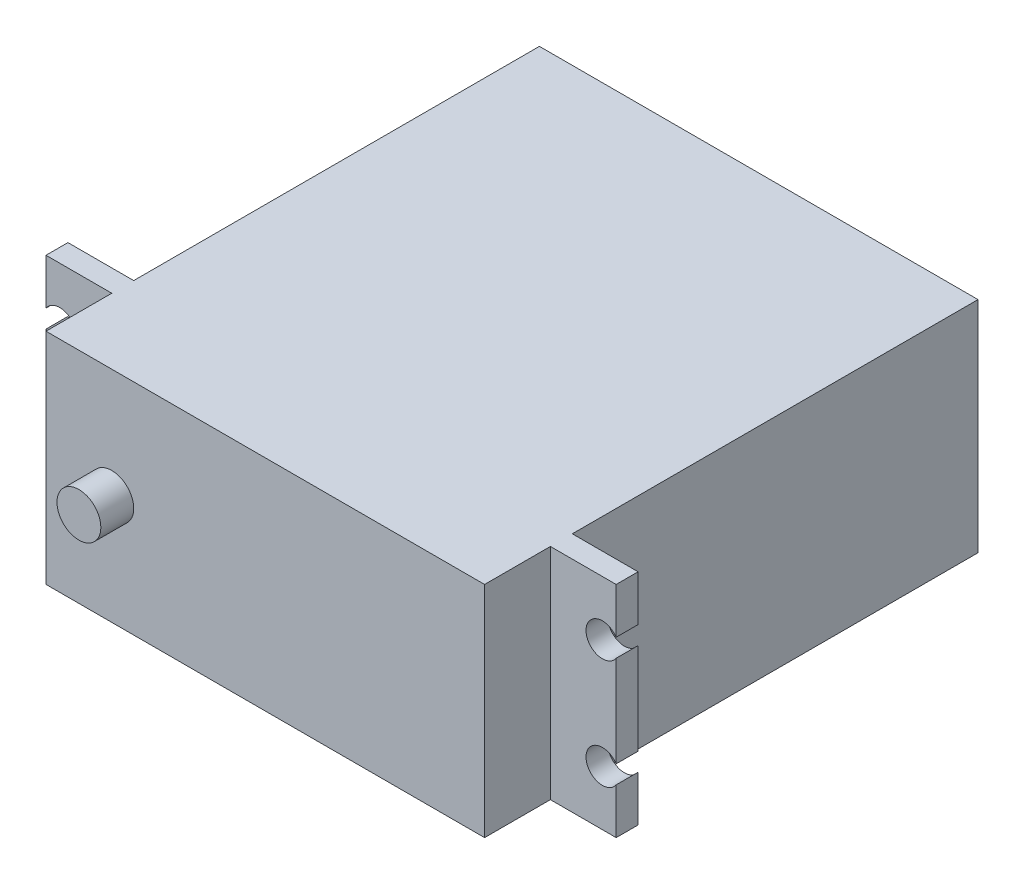
ISO-10303-21;
HEADER;
FILE_DESCRIPTION(('STEP AP214'),'2;1');
FILE_NAME('part.step','',(''),(''),'','','');
FILE_SCHEMA(('AUTOMOTIVE_DESIGN { 1 0 10303 214 1 1 1 1 }'));
ENDSEC;
DATA;
#1=APPLICATION_CONTEXT('core data for automotive mechanical design processes');
#2=APPLICATION_PROTOCOL_DEFINITION('international standard','automotive_design',2000,#1);
#3=PRODUCT_CONTEXT('',#1,'mechanical');
#4=PRODUCT('Part','Part','',(#3));
#5=PRODUCT_RELATED_PRODUCT_CATEGORY('part','',(#4));
#6=PRODUCT_DEFINITION_FORMATION('','',#4);
#7=PRODUCT_DEFINITION_CONTEXT('part definition',#1,'design');
#8=PRODUCT_DEFINITION('design','',#6,#7);
#9=PRODUCT_DEFINITION_SHAPE('','',#8);
#10=(LENGTH_UNIT() NAMED_UNIT(*) SI_UNIT(.MILLI.,.METRE.));
#11=(NAMED_UNIT(*) PLANE_ANGLE_UNIT() SI_UNIT($,.RADIAN.));
#12=(NAMED_UNIT(*) SI_UNIT($,.STERADIAN.) SOLID_ANGLE_UNIT());
#13=UNCERTAINTY_MEASURE_WITH_UNIT(LENGTH_MEASURE(1.E-05),#10,'distance_accuracy_value','');
#14=(GEOMETRIC_REPRESENTATION_CONTEXT(3) GLOBAL_UNCERTAINTY_ASSIGNED_CONTEXT((#13)) GLOBAL_UNIT_ASSIGNED_CONTEXT((#10,
#11,#12)) REPRESENTATION_CONTEXT('',''));
#15=CARTESIAN_POINT('',(0.,0.,0.));
#16=DIRECTION('',(0.,0.,1.));
#17=DIRECTION('',(1.,0.,0.));
#18=AXIS2_PLACEMENT_3D('',#15,#16,#17);
#19=CARTESIAN_POINT('',(-6.,0.,0.));
#20=DIRECTION('',(-1.,0.,0.));
#21=DIRECTION('',(0.,0.,1.));
#22=AXIS2_PLACEMENT_3D('',#19,#20,#21);
#23=PLANE('',#22);
#24=DIRECTION('',(0.,0.,1.));
#25=VECTOR('',#24,1.);
#26=CARTESIAN_POINT('',(-6.,4.17084380241115,33.));
#27=LINE('',#26,#25);
#28=CARTESIAN_POINT('',(-6.,4.17084380241115,37.));
#29=VERTEX_POINT('',#28);
#30=CARTESIAN_POINT('',(-6.,4.17084380241115,39.));
#31=VERTEX_POINT('',#30);
#32=EDGE_CURVE('E49',#29,#31,#27,.T.);
#33=ORIENTED_EDGE('',*,*,#32,.F.);
#34=DIRECTION('',(0.,-1.,0.));
#35=VECTOR('',#34,1.);
#36=CARTESIAN_POINT('',(-6.,20.,37.));
#37=LINE('',#36,#35);
#38=CARTESIAN_POINT('',(-6.,0.,37.));
#39=VERTEX_POINT('',#38);
#40=EDGE_CURVE('E231',#29,#39,#37,.T.);
#41=ORIENTED_EDGE('',*,*,#40,.T.);
#42=DIRECTION('',(0.,0.,1.));
#43=VECTOR('',#42,1.);
#44=CARTESIAN_POINT('',(-6.,0.,37.));
#45=LINE('',#44,#43);
#46=CARTESIAN_POINT('',(-6.,0.,39.));
#47=VERTEX_POINT('',#46);
#48=EDGE_CURVE('E229',#39,#47,#45,.T.);
#49=ORIENTED_EDGE('',*,*,#48,.T.);
#50=DIRECTION('',(0.,1.,0.));
#51=VECTOR('',#50,1.);
#52=CARTESIAN_POINT('',(-6.,20.,39.));
#53=LINE('',#52,#51);
#54=EDGE_CURVE('E234',#47,#31,#53,.T.);
#55=ORIENTED_EDGE('',*,*,#54,.T.);
#56=EDGE_LOOP('',(#33,#41,#49,#55));
#57=FACE_BOUND('',#56,.T.);
#58=ADVANCED_FACE('F34',(#57),#23,.T.);
#59=CARTESIAN_POINT('',(46.,0.,0.));
#60=DIRECTION('',(1.,0.,0.));
#61=DIRECTION('',(0.,0.,-1.));
#62=AXIS2_PLACEMENT_3D('',#59,#60,#61);
#63=PLANE('',#62);
#64=DIRECTION('',(0.,0.,1.));
#65=VECTOR('',#64,1.);
#66=CARTESIAN_POINT('',(46.,15.8291561975889,33.));
#67=LINE('',#66,#65);
#68=CARTESIAN_POINT('',(46.,15.8291561975889,37.));
#69=VERTEX_POINT('',#68);
#70=CARTESIAN_POINT('',(46.,15.8291561975889,39.));
#71=VERTEX_POINT('',#70);
#72=EDGE_CURVE('E42',#69,#71,#67,.T.);
#73=ORIENTED_EDGE('',*,*,#72,.F.);
#74=DIRECTION('',(0.,1.,0.));
#75=VECTOR('',#74,1.);
#76=CARTESIAN_POINT('',(46.,20.,37.));
#77=LINE('',#76,#75);
#78=CARTESIAN_POINT('',(46.,20.,37.));
#79=VERTEX_POINT('',#78);
#80=EDGE_CURVE('E201',#69,#79,#77,.T.);
#81=ORIENTED_EDGE('',*,*,#80,.T.);
#82=DIRECTION('',(0.,0.,1.));
#83=VECTOR('',#82,1.);
#84=CARTESIAN_POINT('',(46.,20.,39.));
#85=LINE('',#84,#83);
#86=CARTESIAN_POINT('',(46.,20.,39.));
#87=VERTEX_POINT('',#86);
#88=EDGE_CURVE('E205',#79,#87,#85,.T.);
#89=ORIENTED_EDGE('',*,*,#88,.T.);
#90=DIRECTION('',(0.,-1.,0.));
#91=VECTOR('',#90,1.);
#92=CARTESIAN_POINT('',(46.,20.,39.));
#93=LINE('',#92,#91);
#94=EDGE_CURVE('E191',#87,#71,#93,.T.);
#95=ORIENTED_EDGE('',*,*,#94,.T.);
#96=EDGE_LOOP('',(#73,#81,#89,#95));
#97=FACE_BOUND('',#96,.T.);
#98=ADVANCED_FACE('F313',(#97),#63,.T.);
#99=DIRECTION('',(0.,0.,1.));
#100=VECTOR('',#99,1.);
#101=CARTESIAN_POINT('',(46.,14.1708438024111,33.));
#102=LINE('',#101,#100);
#103=CARTESIAN_POINT('',(46.,14.1708438024111,39.));
#104=VERTEX_POINT('',#103);
#105=CARTESIAN_POINT('',(46.,14.1708438024111,37.));
#106=VERTEX_POINT('',#105);
#107=EDGE_CURVE('E176',#104,#106,#102,.F.);
#108=ORIENTED_EDGE('',*,*,#107,.F.);
#109=CARTESIAN_POINT('',(46.,5.82915619758885,39.));
#110=VERTEX_POINT('',#109);
#111=EDGE_CURVE('E184',#104,#110,#93,.T.);
#112=ORIENTED_EDGE('',*,*,#111,.T.);
#113=DIRECTION('',(0.,0.,1.));
#114=VECTOR('',#113,1.);
#115=CARTESIAN_POINT('',(46.,5.82915619758885,33.));
#116=LINE('',#115,#114);
#117=CARTESIAN_POINT('',(46.,5.82915619758885,37.));
#118=VERTEX_POINT('',#117);
#119=EDGE_CURVE('E168',#118,#110,#116,.T.);
#120=ORIENTED_EDGE('',*,*,#119,.F.);
#121=EDGE_CURVE('E206',#118,#106,#77,.T.);
#122=ORIENTED_EDGE('',*,*,#121,.T.);
#123=EDGE_LOOP('',(#108,#112,#120,#122));
#124=FACE_BOUND('',#123,.T.);
#125=ADVANCED_FACE('F190',(#124),#63,.T.);
#126=DIRECTION('',(0.,0.,1.));
#127=VECTOR('',#126,1.);
#128=CARTESIAN_POINT('',(-6.,5.82915619758885,33.));
#129=LINE('',#128,#127);
#130=CARTESIAN_POINT('',(-6.,5.82915619758885,39.));
#131=VERTEX_POINT('',#130);
#132=CARTESIAN_POINT('',(-6.,5.82915619758885,37.));
#133=VERTEX_POINT('',#132);
#134=EDGE_CURVE('E341',#131,#133,#129,.F.);
#135=ORIENTED_EDGE('',*,*,#134,.F.);
#136=CARTESIAN_POINT('',(-6.,14.1708438024111,39.));
#137=VERTEX_POINT('',#136);
#138=EDGE_CURVE('E238',#131,#137,#53,.T.);
#139=ORIENTED_EDGE('',*,*,#138,.T.);
#140=DIRECTION('',(0.,0.,1.));
#141=VECTOR('',#140,1.);
#142=CARTESIAN_POINT('',(-6.,14.1708438024111,33.));
#143=LINE('',#142,#141);
#144=CARTESIAN_POINT('',(-6.,14.1708438024111,37.));
#145=VERTEX_POINT('',#144);
#146=EDGE_CURVE('E300',#145,#137,#143,.T.);
#147=ORIENTED_EDGE('',*,*,#146,.F.);
#148=EDGE_CURVE('E230',#145,#133,#37,.T.);
#149=ORIENTED_EDGE('',*,*,#148,.T.);
#150=EDGE_LOOP('',(#135,#139,#147,#149));
#151=FACE_BOUND('',#150,.T.);
#152=ADVANCED_FACE('F372',(#151),#23,.T.);
#153=CARTESIAN_POINT('',(40.,0.,45.));
#154=DIRECTION('',(-1.,0.,0.));
#155=DIRECTION('',(0.,0.,1.));
#156=AXIS2_PLACEMENT_3D('',#153,#154,#155);
#157=PLANE('',#156);
#158=DIRECTION('',(0.,-1.,0.));
#159=VECTOR('',#158,1.);
#160=CARTESIAN_POINT('',(40.,20.,39.));
#161=LINE('',#160,#159);
#162=CARTESIAN_POINT('',(40.,20.,39.));
#163=VERTEX_POINT('',#162);
#164=CARTESIAN_POINT('',(40.,0.,39.));
#165=VERTEX_POINT('',#164);
#166=EDGE_CURVE('E209',#163,#165,#161,.T.);
#167=ORIENTED_EDGE('',*,*,#166,.F.);
#168=DIRECTION('',(0.,0.,-1.));
#169=VECTOR('',#168,1.);
#170=CARTESIAN_POINT('',(40.,20.,45.));
#171=LINE('',#170,#169);
#172=CARTESIAN_POINT('',(40.,20.,45.));
#173=VERTEX_POINT('',#172);
#174=EDGE_CURVE('E285',#173,#163,#171,.T.);
#175=ORIENTED_EDGE('',*,*,#174,.F.);
#176=DIRECTION('',(0.,1.,0.));
#177=VECTOR('',#176,1.);
#178=CARTESIAN_POINT('',(40.,0.,45.));
#179=LINE('',#178,#177);
#180=CARTESIAN_POINT('',(40.,0.,45.));
#181=VERTEX_POINT('',#180);
#182=EDGE_CURVE('E267',#181,#173,#179,.T.);
#183=ORIENTED_EDGE('',*,*,#182,.F.);
#184=DIRECTION('',(0.,0.,-1.));
#185=VECTOR('',#184,1.);
#186=CARTESIAN_POINT('',(40.,0.,45.));
#187=LINE('',#186,#185);
#188=EDGE_CURVE('E289',#181,#165,#187,.T.);
#189=ORIENTED_EDGE('',*,*,#188,.T.);
#190=EDGE_LOOP('',(#167,#175,#183,#189));
#191=FACE_BOUND('',#190,.T.);
#192=ADVANCED_FACE('F322',(#191),#157,.F.);
#193=DIRECTION('',(0.,1.,0.));
#194=VECTOR('',#193,1.);
#195=CARTESIAN_POINT('',(40.,20.,37.));
#196=LINE('',#195,#194);
#197=CARTESIAN_POINT('',(40.,0.,37.));
#198=VERTEX_POINT('',#197);
#199=CARTESIAN_POINT('',(40.,20.,37.));
#200=VERTEX_POINT('',#199);
#201=EDGE_CURVE('E195',#198,#200,#196,.T.);
#202=ORIENTED_EDGE('',*,*,#201,.F.);
#203=CARTESIAN_POINT('',(40.,0.,0.));
#204=VERTEX_POINT('',#203);
#205=EDGE_CURVE('E288',#198,#204,#187,.T.);
#206=ORIENTED_EDGE('',*,*,#205,.T.);
#207=DIRECTION('',(0.,1.,0.));
#208=VECTOR('',#207,1.);
#209=CARTESIAN_POINT('',(40.,0.,0.));
#210=LINE('',#209,#208);
#211=CARTESIAN_POINT('',(40.,20.,0.));
#212=VERTEX_POINT('',#211);
#213=EDGE_CURVE('E277',#204,#212,#210,.T.);
#214=ORIENTED_EDGE('',*,*,#213,.T.);
#215=EDGE_CURVE('E284',#200,#212,#171,.T.);
#216=ORIENTED_EDGE('',*,*,#215,.F.);
#217=EDGE_LOOP('',(#202,#206,#214,#216));
#218=FACE_BOUND('',#217,.T.);
#219=ADVANCED_FACE('F430',(#218),#157,.F.);
#220=CARTESIAN_POINT('',(0.,0.,45.));
#221=DIRECTION('',(1.,0.,0.));
#222=DIRECTION('',(0.,0.,-1.));
#223=AXIS2_PLACEMENT_3D('',#220,#221,#222);
#224=PLANE('',#223);
#225=DIRECTION('',(0.,-1.,0.));
#226=VECTOR('',#225,1.);
#227=CARTESIAN_POINT('',(0.,20.,37.));
#228=LINE('',#227,#226);
#229=CARTESIAN_POINT('',(0.,20.,37.));
#230=VERTEX_POINT('',#229);
#231=CARTESIAN_POINT('',(0.,0.,37.));
#232=VERTEX_POINT('',#231);
#233=EDGE_CURVE('E225',#230,#232,#228,.T.);
#234=ORIENTED_EDGE('',*,*,#233,.F.);
#235=DIRECTION('',(0.,0.,-1.));
#236=VECTOR('',#235,1.);
#237=CARTESIAN_POINT('',(0.,20.,45.));
#238=LINE('',#237,#236);
#239=CARTESIAN_POINT('',(0.,20.,0.));
#240=VERTEX_POINT('',#239);
#241=EDGE_CURVE('E271',#230,#240,#238,.T.);
#242=ORIENTED_EDGE('',*,*,#241,.T.);
#243=DIRECTION('',(0.,-1.,0.));
#244=VECTOR('',#243,1.);
#245=CARTESIAN_POINT('',(0.,0.,0.));
#246=LINE('',#245,#244);
#247=CARTESIAN_POINT('',(0.,0.,0.));
#248=VERTEX_POINT('',#247);
#249=EDGE_CURVE('E260',#240,#248,#246,.T.);
#250=ORIENTED_EDGE('',*,*,#249,.T.);
#251=DIRECTION('',(0.,0.,-1.));
#252=VECTOR('',#251,1.);
#253=CARTESIAN_POINT('',(0.,0.,45.));
#254=LINE('',#253,#252);
#255=EDGE_CURVE('E291',#232,#248,#254,.T.);
#256=ORIENTED_EDGE('',*,*,#255,.F.);
#257=EDGE_LOOP('',(#234,#242,#250,#256));
#258=FACE_BOUND('',#257,.T.);
#259=ADVANCED_FACE('F36',(#258),#224,.F.);
#260=DIRECTION('',(0.,1.,0.));
#261=VECTOR('',#260,1.);
#262=CARTESIAN_POINT('',(0.,20.,39.));
#263=LINE('',#262,#261);
#264=CARTESIAN_POINT('',(0.,0.,39.));
#265=VERTEX_POINT('',#264);
#266=CARTESIAN_POINT('',(0.,20.,39.));
#267=VERTEX_POINT('',#266);
#268=EDGE_CURVE('E243',#265,#267,#263,.T.);
#269=ORIENTED_EDGE('',*,*,#268,.F.);
#270=CARTESIAN_POINT('',(0.,0.,45.));
#271=VERTEX_POINT('',#270);
#272=EDGE_CURVE('E292',#271,#265,#254,.T.);
#273=ORIENTED_EDGE('',*,*,#272,.F.);
#274=DIRECTION('',(0.,-1.,0.));
#275=VECTOR('',#274,1.);
#276=CARTESIAN_POINT('',(0.,0.,45.));
#277=LINE('',#276,#275);
#278=CARTESIAN_POINT('',(0.,20.,45.));
#279=VERTEX_POINT('',#278);
#280=EDGE_CURVE('E261',#279,#271,#277,.T.);
#281=ORIENTED_EDGE('',*,*,#280,.F.);
#282=EDGE_CURVE('E282',#279,#267,#238,.T.);
#283=ORIENTED_EDGE('',*,*,#282,.T.);
#284=EDGE_LOOP('',(#269,#273,#281,#283));
#285=FACE_BOUND('',#284,.T.);
#286=ADVANCED_FACE('F381',(#285),#224,.F.);
#287=CARTESIAN_POINT('',(0.,0.,45.));
#288=DIRECTION('',(0.,1.,0.));
#289=DIRECTION('',(0.,0.,1.));
#290=AXIS2_PLACEMENT_3D('',#287,#288,#289);
#291=PLANE('',#290);
#292=DIRECTION('',(1.,0.,0.));
#293=VECTOR('',#292,1.);
#294=CARTESIAN_POINT('',(0.,0.,0.));
#295=LINE('',#294,#293);
#296=EDGE_CURVE('E274',#248,#204,#295,.T.);
#297=ORIENTED_EDGE('',*,*,#296,.T.);
#298=ORIENTED_EDGE('',*,*,#205,.F.);
#299=DIRECTION('',(-1.,0.,0.));
#300=VECTOR('',#299,1.);
#301=CARTESIAN_POINT('',(46.,0.,37.));
#302=LINE('',#301,#300);
#303=CARTESIAN_POINT('',(46.,0.,37.));
#304=VERTEX_POINT('',#303);
#305=EDGE_CURVE('E219',#304,#198,#302,.T.);
#306=ORIENTED_EDGE('',*,*,#305,.F.);
#307=DIRECTION('',(0.,0.,-1.));
#308=VECTOR('',#307,1.);
#309=CARTESIAN_POINT('',(46.,0.,39.));
#310=LINE('',#309,#308);
#311=CARTESIAN_POINT('',(46.,0.,39.));
#312=VERTEX_POINT('',#311);
#313=EDGE_CURVE('E194',#312,#304,#310,.T.);
#314=ORIENTED_EDGE('',*,*,#313,.F.);
#315=DIRECTION('',(-1.,0.,0.));
#316=VECTOR('',#315,1.);
#317=CARTESIAN_POINT('',(46.,0.,39.));
#318=LINE('',#317,#316);
#319=EDGE_CURVE('E222',#312,#165,#318,.T.);
#320=ORIENTED_EDGE('',*,*,#319,.T.);
#321=ORIENTED_EDGE('',*,*,#188,.F.);
#322=DIRECTION('',(1.,0.,0.));
#323=VECTOR('',#322,1.);
#324=CARTESIAN_POINT('',(0.,0.,45.));
#325=LINE('',#324,#323);
#326=EDGE_CURVE('E264',#271,#181,#325,.T.);
#327=ORIENTED_EDGE('',*,*,#326,.F.);
#328=ORIENTED_EDGE('',*,*,#272,.T.);
#329=DIRECTION('',(1.,0.,0.));
#330=VECTOR('',#329,1.);
#331=CARTESIAN_POINT('',(-6.,0.,39.));
#332=LINE('',#331,#330);
#333=EDGE_CURVE('E251',#47,#265,#332,.T.);
#334=ORIENTED_EDGE('',*,*,#333,.F.);
#335=ORIENTED_EDGE('',*,*,#48,.F.);
#336=DIRECTION('',(1.,0.,0.));
#337=VECTOR('',#336,1.);
#338=CARTESIAN_POINT('',(-6.,0.,37.));
#339=LINE('',#338,#337);
#340=EDGE_CURVE('E254',#39,#232,#339,.T.);
#341=ORIENTED_EDGE('',*,*,#340,.T.);
#342=ORIENTED_EDGE('',*,*,#255,.T.);
#343=EDGE_LOOP('',(#297,#298,#306,#314,#320,#321,#327,#328,#334,#335,#341,#342));
#344=FACE_BOUND('',#343,.T.);
#345=ADVANCED_FACE('F327',(#344),#291,.F.);
#346=CARTESIAN_POINT('',(0.,20.,45.));
#347=DIRECTION('',(0.,-1.,0.));
#348=DIRECTION('',(0.,0.,-1.));
#349=AXIS2_PLACEMENT_3D('',#346,#347,#348);
#350=PLANE('',#349);
#351=DIRECTION('',(-1.,0.,0.));
#352=VECTOR('',#351,1.);
#353=CARTESIAN_POINT('',(0.,20.,0.));
#354=LINE('',#353,#352);
#355=EDGE_CURVE('E265',#212,#240,#354,.T.);
#356=ORIENTED_EDGE('',*,*,#355,.T.);
#357=ORIENTED_EDGE('',*,*,#241,.F.);
#358=DIRECTION('',(1.,0.,0.));
#359=VECTOR('',#358,1.);
#360=CARTESIAN_POINT('',(-6.,20.,37.));
#361=LINE('',#360,#359);
#362=CARTESIAN_POINT('',(-6.,20.,37.));
#363=VERTEX_POINT('',#362);
#364=EDGE_CURVE('E240',#363,#230,#361,.T.);
#365=ORIENTED_EDGE('',*,*,#364,.F.);
#366=DIRECTION('',(0.,0.,-1.));
#367=VECTOR('',#366,1.);
#368=CARTESIAN_POINT('',(-6.,20.,37.));
#369=LINE('',#368,#367);
#370=CARTESIAN_POINT('',(-6.,20.,39.));
#371=VERTEX_POINT('',#370);
#372=EDGE_CURVE('E237',#371,#363,#369,.T.);
#373=ORIENTED_EDGE('',*,*,#372,.F.);
#374=DIRECTION('',(1.,0.,0.));
#375=VECTOR('',#374,1.);
#376=CARTESIAN_POINT('',(-6.,20.,39.));
#377=LINE('',#376,#375);
#378=EDGE_CURVE('E248',#371,#267,#377,.T.);
#379=ORIENTED_EDGE('',*,*,#378,.T.);
#380=ORIENTED_EDGE('',*,*,#282,.F.);
#381=DIRECTION('',(-1.,0.,0.));
#382=VECTOR('',#381,1.);
#383=CARTESIAN_POINT('',(0.,20.,45.));
#384=LINE('',#383,#382);
#385=EDGE_CURVE('E269',#173,#279,#384,.T.);
#386=ORIENTED_EDGE('',*,*,#385,.F.);
#387=ORIENTED_EDGE('',*,*,#174,.T.);
#388=DIRECTION('',(-1.,0.,0.));
#389=VECTOR('',#388,1.);
#390=CARTESIAN_POINT('',(46.,20.,39.));
#391=LINE('',#390,#389);
#392=EDGE_CURVE('E208',#87,#163,#391,.T.);
#393=ORIENTED_EDGE('',*,*,#392,.F.);
#394=ORIENTED_EDGE('',*,*,#88,.F.);
#395=DIRECTION('',(-1.,0.,0.));
#396=VECTOR('',#395,1.);
#397=CARTESIAN_POINT('',(46.,20.,37.));
#398=LINE('',#397,#396);
#399=EDGE_CURVE('E216',#79,#200,#398,.T.);
#400=ORIENTED_EDGE('',*,*,#399,.T.);
#401=ORIENTED_EDGE('',*,*,#215,.T.);
#402=EDGE_LOOP('',(#356,#357,#365,#373,#379,#380,#386,#387,#393,#394,#400,#401));
#403=FACE_BOUND('',#402,.T.);
#404=ADVANCED_FACE('F318',(#403),#350,.F.);
#405=CARTESIAN_POINT('',(0.,0.,45.));
#406=DIRECTION('',(0.,0.,-1.));
#407=DIRECTION('',(-1.,0.,0.));
#408=AXIS2_PLACEMENT_3D('',#405,#406,#407);
#409=PLANE('',#408);
#410=CARTESIAN_POINT('',(6.,10.,45.));
#411=DIRECTION('',(0.,0.,-1.));
#412=DIRECTION('',(-1.,0.,0.));
#413=AXIS2_PLACEMENT_3D('',#410,#411,#412);
#414=CIRCLE('',#413,2.);
#415=CARTESIAN_POINT('',(4.,10.,45.));
#416=VERTEX_POINT('',#415);
#417=EDGE_CURVE('E295',#416,#416,#414,.F.);
#418=ORIENTED_EDGE('',*,*,#417,.F.);
#419=EDGE_LOOP('',(#418));
#420=FACE_BOUND('',#419,.T.);
#421=ORIENTED_EDGE('',*,*,#280,.T.);
#422=ORIENTED_EDGE('',*,*,#326,.T.);
#423=ORIENTED_EDGE('',*,*,#182,.T.);
#424=ORIENTED_EDGE('',*,*,#385,.T.);
#425=EDGE_LOOP('',(#421,#422,#423,#424));
#426=FACE_BOUND('',#425,.T.);
#427=ADVANCED_FACE('F383',(#420,#426),#409,.F.);
#428=CARTESIAN_POINT('',(0.,0.,0.));
#429=DIRECTION('',(0.,0.,-1.));
#430=DIRECTION('',(-1.,0.,0.));
#431=AXIS2_PLACEMENT_3D('',#428,#429,#430);
#432=PLANE('',#431);
#433=ORIENTED_EDGE('',*,*,#249,.F.);
#434=ORIENTED_EDGE('',*,*,#355,.F.);
#435=ORIENTED_EDGE('',*,*,#213,.F.);
#436=ORIENTED_EDGE('',*,*,#296,.F.);
#437=EDGE_LOOP('',(#433,#434,#435,#436));
#438=FACE_BOUND('',#437,.T.);
#439=ADVANCED_FACE('F419',(#438),#432,.T.);
#440=CARTESIAN_POINT('',(6.,10.,48.));
#441=DIRECTION('',(0.,0.,-1.));
#442=DIRECTION('',(-1.,0.,0.));
#443=AXIS2_PLACEMENT_3D('',#440,#441,#442);
#444=CYLINDRICAL_SURFACE('',#443,2.);
#445=CARTESIAN_POINT('',(6.,10.,48.));
#446=DIRECTION('',(0.,0.,1.));
#447=DIRECTION('',(1.,0.,0.));
#448=AXIS2_PLACEMENT_3D('',#445,#446,#447);
#449=CIRCLE('',#448,2.);
#450=CARTESIAN_POINT('',(8.,10.,48.));
#451=VERTEX_POINT('',#450);
#452=EDGE_CURVE('E257',#451,#451,#449,.T.);
#453=ORIENTED_EDGE('',*,*,#452,.F.);
#454=EDGE_LOOP('',(#453));
#455=FACE_BOUND('',#454,.T.);
#456=ORIENTED_EDGE('',*,*,#417,.T.);
#457=EDGE_LOOP('',(#456));
#458=FACE_BOUND('',#457,.T.);
#459=ADVANCED_FACE('F415',(#455,#458),#444,.T.);
#460=CARTESIAN_POINT('',(6.,10.,48.));
#461=DIRECTION('',(0.,0.,1.));
#462=DIRECTION('',(1.,0.,0.));
#463=AXIS2_PLACEMENT_3D('',#460,#461,#462);
#464=PLANE('',#463);
#465=ORIENTED_EDGE('',*,*,#452,.T.);
#466=EDGE_LOOP('',(#465));
#467=FACE_BOUND('',#466,.T.);
#468=ADVANCED_FACE('F410',(#467),#464,.T.);
#469=CARTESIAN_POINT('',(-6.,20.,37.));
#470=DIRECTION('',(0.,0.,1.));
#471=DIRECTION('',(1.,0.,0.));
#472=AXIS2_PLACEMENT_3D('',#469,#470,#471);
#473=PLANE('',#472);
#474=ORIENTED_EDGE('',*,*,#40,.F.);
#475=CARTESIAN_POINT('',(-4.75,5.,37.));
#476=DIRECTION('',(0.,0.,1.));
#477=DIRECTION('',(1.,0.,0.));
#478=AXIS2_PLACEMENT_3D('',#475,#476,#477);
#479=CIRCLE('',#478,1.5);
#480=EDGE_CURVE('E336',#29,#133,#479,.T.);
#481=ORIENTED_EDGE('',*,*,#480,.T.);
#482=ORIENTED_EDGE('',*,*,#148,.F.);
#483=CARTESIAN_POINT('',(-4.75,15.,37.));
#484=DIRECTION('',(0.,0.,1.));
#485=DIRECTION('',(1.,0.,0.));
#486=AXIS2_PLACEMENT_3D('',#483,#484,#485);
#487=CIRCLE('',#486,1.5);
#488=CARTESIAN_POINT('',(-6.,15.8291561975888,37.));
#489=VERTEX_POINT('',#488);
#490=EDGE_CURVE('E198',#145,#489,#487,.T.);
#491=ORIENTED_EDGE('',*,*,#490,.T.);
#492=EDGE_CURVE('E226',#363,#489,#37,.T.);
#493=ORIENTED_EDGE('',*,*,#492,.F.);
#494=ORIENTED_EDGE('',*,*,#364,.T.);
#495=ORIENTED_EDGE('',*,*,#233,.T.);
#496=ORIENTED_EDGE('',*,*,#340,.F.);
#497=EDGE_LOOP('',(#474,#481,#482,#491,#493,#494,#495,#496));
#498=FACE_BOUND('',#497,.T.);
#499=ADVANCED_FACE('F352',(#498),#473,.F.);
#500=CARTESIAN_POINT('',(-6.,20.,39.));
#501=DIRECTION('',(0.,0.,-1.));
#502=DIRECTION('',(-1.,0.,0.));
#503=AXIS2_PLACEMENT_3D('',#500,#501,#502);
#504=PLANE('',#503);
#505=ORIENTED_EDGE('',*,*,#138,.F.);
#506=CARTESIAN_POINT('',(-4.75,5.,39.));
#507=DIRECTION('',(0.,0.,-1.));
#508=DIRECTION('',(-1.,0.,0.));
#509=AXIS2_PLACEMENT_3D('',#506,#507,#508);
#510=CIRCLE('',#509,1.5);
#511=EDGE_CURVE('E11',#131,#31,#510,.T.);
#512=ORIENTED_EDGE('',*,*,#511,.T.);
#513=ORIENTED_EDGE('',*,*,#54,.F.);
#514=ORIENTED_EDGE('',*,*,#333,.T.);
#515=ORIENTED_EDGE('',*,*,#268,.T.);
#516=ORIENTED_EDGE('',*,*,#378,.F.);
#517=CARTESIAN_POINT('',(-6.,15.8291561975888,39.));
#518=VERTEX_POINT('',#517);
#519=EDGE_CURVE('E233',#518,#371,#53,.T.);
#520=ORIENTED_EDGE('',*,*,#519,.F.);
#521=CARTESIAN_POINT('',(-4.75,15.,39.));
#522=DIRECTION('',(0.,0.,1.));
#523=DIRECTION('',(1.,0.,0.));
#524=AXIS2_PLACEMENT_3D('',#521,#522,#523);
#525=CIRCLE('',#524,1.5);
#526=EDGE_CURVE('E343',#137,#518,#525,.T.);
#527=ORIENTED_EDGE('',*,*,#526,.F.);
#528=EDGE_LOOP('',(#505,#512,#513,#514,#515,#516,#520,#527));
#529=FACE_BOUND('',#528,.T.);
#530=ADVANCED_FACE('F376',(#529),#504,.F.);
#531=DIRECTION('',(0.,0.,1.));
#532=VECTOR('',#531,1.);
#533=CARTESIAN_POINT('',(-6.,15.8291561975888,33.));
#534=LINE('',#533,#532);
#535=EDGE_CURVE('E298',#518,#489,#534,.F.);
#536=ORIENTED_EDGE('',*,*,#535,.F.);
#537=ORIENTED_EDGE('',*,*,#519,.T.);
#538=ORIENTED_EDGE('',*,*,#372,.T.);
#539=ORIENTED_EDGE('',*,*,#492,.T.);
#540=EDGE_LOOP('',(#536,#537,#538,#539));
#541=FACE_BOUND('',#540,.T.);
#542=ADVANCED_FACE('F356',(#541),#23,.T.);
#543=CARTESIAN_POINT('',(46.,20.,39.));
#544=DIRECTION('',(0.,0.,-1.));
#545=DIRECTION('',(-1.,0.,0.));
#546=AXIS2_PLACEMENT_3D('',#543,#544,#545);
#547=PLANE('',#546);
#548=ORIENTED_EDGE('',*,*,#111,.F.);
#549=CARTESIAN_POINT('',(44.75,15.,39.));
#550=DIRECTION('',(0.,0.,1.));
#551=DIRECTION('',(1.,0.,0.));
#552=AXIS2_PLACEMENT_3D('',#549,#550,#551);
#553=CIRCLE('',#552,1.5);
#554=EDGE_CURVE('E187',#71,#104,#553,.T.);
#555=ORIENTED_EDGE('',*,*,#554,.F.);
#556=ORIENTED_EDGE('',*,*,#94,.F.);
#557=ORIENTED_EDGE('',*,*,#392,.T.);
#558=ORIENTED_EDGE('',*,*,#166,.T.);
#559=ORIENTED_EDGE('',*,*,#319,.F.);
#560=CARTESIAN_POINT('',(46.,4.17084380241115,39.));
#561=VERTEX_POINT('',#560);
#562=EDGE_CURVE('E186',#561,#312,#93,.T.);
#563=ORIENTED_EDGE('',*,*,#562,.F.);
#564=CARTESIAN_POINT('',(44.75,5.,39.));
#565=DIRECTION('',(0.,0.,1.));
#566=DIRECTION('',(1.,0.,0.));
#567=AXIS2_PLACEMENT_3D('',#564,#565,#566);
#568=CIRCLE('',#567,1.5);
#569=EDGE_CURVE('E56',#110,#561,#568,.T.);
#570=ORIENTED_EDGE('',*,*,#569,.F.);
#571=EDGE_LOOP('',(#548,#555,#556,#557,#558,#559,#563,#570));
#572=FACE_BOUND('',#571,.T.);
#573=ADVANCED_FACE('F182',(#572),#547,.F.);
#574=CARTESIAN_POINT('',(46.,20.,37.));
#575=DIRECTION('',(0.,0.,1.));
#576=DIRECTION('',(1.,0.,0.));
#577=AXIS2_PLACEMENT_3D('',#574,#575,#576);
#578=PLANE('',#577);
#579=ORIENTED_EDGE('',*,*,#80,.F.);
#580=CARTESIAN_POINT('',(44.75,15.,37.));
#581=DIRECTION('',(0.,0.,1.));
#582=DIRECTION('',(1.,0.,0.));
#583=AXIS2_PLACEMENT_3D('',#580,#581,#582);
#584=CIRCLE('',#583,1.5);
#585=EDGE_CURVE('E308',#69,#106,#584,.T.);
#586=ORIENTED_EDGE('',*,*,#585,.T.);
#587=ORIENTED_EDGE('',*,*,#121,.F.);
#588=CARTESIAN_POINT('',(44.75,5.,37.));
#589=DIRECTION('',(0.,0.,1.));
#590=DIRECTION('',(1.,0.,0.));
#591=AXIS2_PLACEMENT_3D('',#588,#589,#590);
#592=CIRCLE('',#591,1.5);
#593=CARTESIAN_POINT('',(46.,4.17084380241115,37.));
#594=VERTEX_POINT('',#593);
#595=EDGE_CURVE('E171',#118,#594,#592,.T.);
#596=ORIENTED_EDGE('',*,*,#595,.T.);
#597=EDGE_CURVE('E202',#304,#594,#77,.T.);
#598=ORIENTED_EDGE('',*,*,#597,.F.);
#599=ORIENTED_EDGE('',*,*,#305,.T.);
#600=ORIENTED_EDGE('',*,*,#201,.T.);
#601=ORIENTED_EDGE('',*,*,#399,.F.);
#602=EDGE_LOOP('',(#579,#586,#587,#596,#598,#599,#600,#601));
#603=FACE_BOUND('',#602,.T.);
#604=ADVANCED_FACE('F334',(#603),#578,.F.);
#605=DIRECTION('',(0.,0.,1.));
#606=VECTOR('',#605,1.);
#607=CARTESIAN_POINT('',(46.,4.17084380241115,33.));
#608=LINE('',#607,#606);
#609=EDGE_CURVE('E177',#561,#594,#608,.F.);
#610=ORIENTED_EDGE('',*,*,#609,.F.);
#611=ORIENTED_EDGE('',*,*,#562,.T.);
#612=ORIENTED_EDGE('',*,*,#313,.T.);
#613=ORIENTED_EDGE('',*,*,#597,.T.);
#614=EDGE_LOOP('',(#610,#611,#612,#613));
#615=FACE_BOUND('',#614,.T.);
#616=ADVANCED_FACE('F332',(#615),#63,.T.);
#617=CARTESIAN_POINT('',(-4.75,15.,33.));
#618=DIRECTION('',(0.,0.,1.));
#619=DIRECTION('',(1.,0.,0.));
#620=AXIS2_PLACEMENT_3D('',#617,#618,#619);
#621=CYLINDRICAL_SURFACE('',#620,1.5);
#622=ORIENTED_EDGE('',*,*,#146,.T.);
#623=ORIENTED_EDGE('',*,*,#526,.T.);
#624=ORIENTED_EDGE('',*,*,#535,.T.);
#625=ORIENTED_EDGE('',*,*,#490,.F.);
#626=EDGE_LOOP('',(#622,#623,#624,#625));
#627=FACE_BOUND('',#626,.T.);
#628=ADVANCED_FACE('F374',(#627),#621,.F.);
#629=CARTESIAN_POINT('',(44.75,5.,33.));
#630=DIRECTION('',(0.,0.,1.));
#631=DIRECTION('',(1.,0.,0.));
#632=AXIS2_PLACEMENT_3D('',#629,#630,#631);
#633=CYLINDRICAL_SURFACE('',#632,1.5);
#634=ORIENTED_EDGE('',*,*,#119,.T.);
#635=ORIENTED_EDGE('',*,*,#569,.T.);
#636=ORIENTED_EDGE('',*,*,#609,.T.);
#637=ORIENTED_EDGE('',*,*,#595,.F.);
#638=EDGE_LOOP('',(#634,#635,#636,#637));
#639=FACE_BOUND('',#638,.T.);
#640=ADVANCED_FACE('F169',(#639),#633,.F.);
#641=CARTESIAN_POINT('',(44.75,15.,33.));
#642=DIRECTION('',(0.,0.,1.));
#643=DIRECTION('',(1.,0.,0.));
#644=AXIS2_PLACEMENT_3D('',#641,#642,#643);
#645=CYLINDRICAL_SURFACE('',#644,1.5);
#646=ORIENTED_EDGE('',*,*,#72,.T.);
#647=ORIENTED_EDGE('',*,*,#554,.T.);
#648=ORIENTED_EDGE('',*,*,#107,.T.);
#649=ORIENTED_EDGE('',*,*,#585,.F.);
#650=EDGE_LOOP('',(#646,#647,#648,#649));
#651=FACE_BOUND('',#650,.T.);
#652=ADVANCED_FACE('F306',(#651),#645,.F.);
#653=CARTESIAN_POINT('',(-4.75,5.,33.));
#654=DIRECTION('',(0.,0.,1.));
#655=DIRECTION('',(1.,0.,0.));
#656=AXIS2_PLACEMENT_3D('',#653,#654,#655);
#657=CYLINDRICAL_SURFACE('',#656,1.5);
#658=ORIENTED_EDGE('',*,*,#32,.T.);
#659=ORIENTED_EDGE('',*,*,#511,.F.);
#660=ORIENTED_EDGE('',*,*,#134,.T.);
#661=ORIENTED_EDGE('',*,*,#480,.F.);
#662=EDGE_LOOP('',(#658,#659,#660,#661));
#663=FACE_BOUND('',#662,.T.);
#664=ADVANCED_FACE('F384',(#663),#657,.F.);
#665=CLOSED_SHELL('',(#58,#98,#125,#152,#192,#219,#259,#286,#345,#404,#427,#439,#459,#468,#499,
#530,#542,#573,#604,#616,#628,#640,#652,#664));
#666=MANIFOLD_SOLID_BREP('B2',#665);
#667=ADVANCED_BREP_SHAPE_REPRESENTATION('',(#18,#666),#14);
#668=SHAPE_DEFINITION_REPRESENTATION(#9,#667);
ENDSEC;
END-ISO-10303-21;
